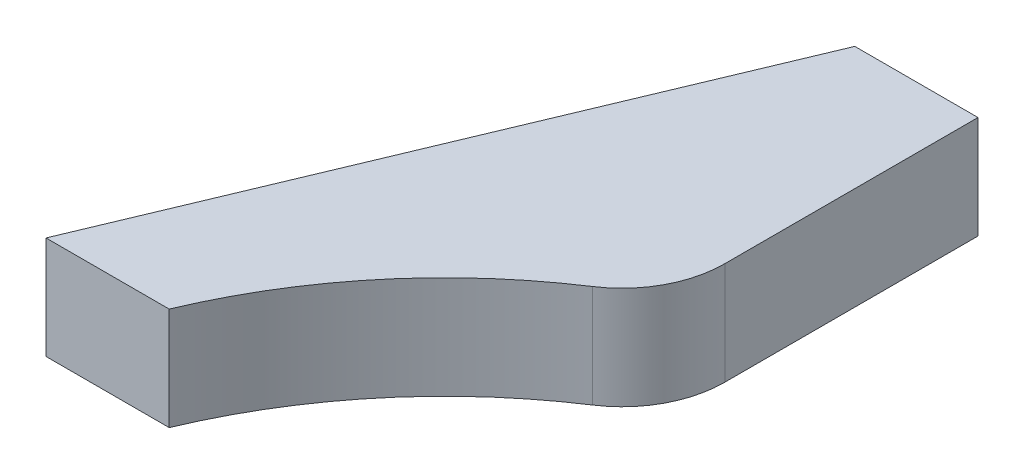
ISO-10303-21;
HEADER;
FILE_DESCRIPTION(('STEP AP214'),'2;1');
FILE_NAME('part.step','',(''),(''),'','','');
FILE_SCHEMA(('AUTOMOTIVE_DESIGN { 1 0 10303 214 1 1 1 1 }'));
ENDSEC;
DATA;
#1=APPLICATION_CONTEXT('core data for automotive mechanical design processes');
#2=APPLICATION_PROTOCOL_DEFINITION('international standard','automotive_design',2000,#1);
#3=PRODUCT_CONTEXT('',#1,'mechanical');
#4=PRODUCT('Part','Part','',(#3));
#5=PRODUCT_RELATED_PRODUCT_CATEGORY('part','',(#4));
#6=PRODUCT_DEFINITION_FORMATION('','',#4);
#7=PRODUCT_DEFINITION_CONTEXT('part definition',#1,'design');
#8=PRODUCT_DEFINITION('design','',#6,#7);
#9=PRODUCT_DEFINITION_SHAPE('','',#8);
#10=(LENGTH_UNIT() NAMED_UNIT(*) SI_UNIT(.MILLI.,.METRE.));
#11=(NAMED_UNIT(*) PLANE_ANGLE_UNIT() SI_UNIT($,.RADIAN.));
#12=(NAMED_UNIT(*) SI_UNIT($,.STERADIAN.) SOLID_ANGLE_UNIT());
#13=UNCERTAINTY_MEASURE_WITH_UNIT(LENGTH_MEASURE(1.E-05),#10,'distance_accuracy_value','');
#14=(GEOMETRIC_REPRESENTATION_CONTEXT(3) GLOBAL_UNCERTAINTY_ASSIGNED_CONTEXT((#13)) GLOBAL_UNIT_ASSIGNED_CONTEXT((#10,
#11,#12)) REPRESENTATION_CONTEXT('',''));
#15=CARTESIAN_POINT('',(0.,0.,0.));
#16=DIRECTION('',(0.,0.,1.));
#17=DIRECTION('',(1.,0.,0.));
#18=AXIS2_PLACEMENT_3D('',#15,#16,#17);
#19=CARTESIAN_POINT('',(0.,5.,0.));
#20=DIRECTION('',(0.,1.,0.));
#21=DIRECTION('',(0.,0.,1.));
#22=AXIS2_PLACEMENT_3D('',#19,#20,#21);
#23=PLANE('',#22);
#24=DIRECTION('',(1.,0.,0.));
#25=VECTOR('',#24,1.);
#26=CARTESIAN_POINT('',(0.,5.,18.5500745429482));
#27=LINE('',#26,#25);
#28=CARTESIAN_POINT('',(-3.,5.,18.5500745429482));
#29=VERTEX_POINT('',#28);
#30=CARTESIAN_POINT('',(3.,5.,18.5500745429482));
#31=VERTEX_POINT('',#30);
#32=EDGE_CURVE('E102',#29,#31,#27,.T.);
#33=ORIENTED_EDGE('',*,*,#32,.F.);
#34=DIRECTION('',(-0.38580699347817,0.,0.922579516238755));
#35=VECTOR('',#34,1.);
#36=CARTESIAN_POINT('',(-3.,5.,18.5500745429482));
#37=LINE('',#36,#35);
#38=CARTESIAN_POINT('',(-14.6149676840736,5.,46.3249242689621));
#39=VERTEX_POINT('',#38);
#40=EDGE_CURVE('E104',#29,#39,#37,.T.);
#41=ORIENTED_EDGE('',*,*,#40,.T.);
#42=DIRECTION('',(1.,0.,0.));
#43=VECTOR('',#42,1.);
#44=CARTESIAN_POINT('',(0.,5.,46.3249242689621));
#45=LINE('',#44,#43);
#46=CARTESIAN_POINT('',(-8.61496768407357,5.,46.3249242689621));
#47=VERTEX_POINT('',#46);
#48=EDGE_CURVE('E145',#39,#47,#45,.T.);
#49=ORIENTED_EDGE('',*,*,#48,.T.);
#50=CARTESIAN_POINT('',(14.4495202218953,5.,55.9700991059163));
#51=DIRECTION('',(0.,-1.,0.));
#52=DIRECTION('',(0.,0.,1.));
#53=AXIS2_PLACEMENT_3D('',#50,#51,#52);
#54=CIRCLE('',#53,25.);
#55=CARTESIAN_POINT('',(0.741586703649219,5.,35.0633404221953));
#56=VERTEX_POINT('',#55);
#57=EDGE_CURVE('E125',#47,#56,#54,.T.);
#58=ORIENTED_EDGE('',*,*,#57,.T.);
#59=CARTESIAN_POINT('',(-1.99999999999999,5.,30.8819886854511));
#60=DIRECTION('',(0.,1.,0.));
#61=DIRECTION('',(0.,0.,1.));
#62=AXIS2_PLACEMENT_3D('',#59,#60,#61);
#63=CIRCLE('',#62,5.);
#64=CARTESIAN_POINT('',(3.,5.,30.8819886854511));
#65=VERTEX_POINT('',#64);
#66=EDGE_CURVE('E65',#56,#65,#63,.T.);
#67=ORIENTED_EDGE('',*,*,#66,.T.);
#68=DIRECTION('',(0.,0.,-1.));
#69=VECTOR('',#68,1.);
#70=CARTESIAN_POINT('',(3.00000000000001,5.,43.8541019662497));
#71=LINE('',#70,#69);
#72=EDGE_CURVE('E118',#65,#31,#71,.T.);
#73=ORIENTED_EDGE('',*,*,#72,.T.);
#74=EDGE_LOOP('',(#33,#41,#49,#58,#67,#73));
#75=FACE_BOUND('',#74,.T.);
#76=ADVANCED_FACE('F42',(#75),#23,.T.);
#77=CARTESIAN_POINT('',(0.,0.,0.));
#78=DIRECTION('',(0.,1.,0.));
#79=DIRECTION('',(0.,0.,1.));
#80=AXIS2_PLACEMENT_3D('',#77,#78,#79);
#81=PLANE('',#80);
#82=DIRECTION('',(-0.38580699347817,0.,0.922579516238755));
#83=VECTOR('',#82,1.);
#84=CARTESIAN_POINT('',(-3.,0.,18.5500745429482));
#85=LINE('',#84,#83);
#86=CARTESIAN_POINT('',(-3.,0.,18.5500745429482));
#87=VERTEX_POINT('',#86);
#88=CARTESIAN_POINT('',(-14.6149676840736,0.,46.3249242689621));
#89=VERTEX_POINT('',#88);
#90=EDGE_CURVE('E113',#87,#89,#85,.T.);
#91=ORIENTED_EDGE('',*,*,#90,.F.);
#92=DIRECTION('',(1.,0.,0.));
#93=VECTOR('',#92,1.);
#94=CARTESIAN_POINT('',(0.,0.,18.5500745429482));
#95=LINE('',#94,#93);
#96=CARTESIAN_POINT('',(3.,0.,18.5500745429482));
#97=VERTEX_POINT('',#96);
#98=EDGE_CURVE('E99',#87,#97,#95,.T.);
#99=ORIENTED_EDGE('',*,*,#98,.T.);
#100=DIRECTION('',(0.,0.,-1.));
#101=VECTOR('',#100,1.);
#102=CARTESIAN_POINT('',(3.,0.,3.35410196624968));
#103=LINE('',#102,#101);
#104=CARTESIAN_POINT('',(3.00000000000001,0.,30.8819886854511));
#105=VERTEX_POINT('',#104);
#106=EDGE_CURVE('E109',#105,#97,#103,.T.);
#107=ORIENTED_EDGE('',*,*,#106,.F.);
#108=CARTESIAN_POINT('',(-1.99999999999999,0.,30.8819886854511));
#109=DIRECTION('',(0.,1.,0.));
#110=DIRECTION('',(0.,0.,1.));
#111=AXIS2_PLACEMENT_3D('',#108,#109,#110);
#112=CIRCLE('',#111,5.);
#113=CARTESIAN_POINT('',(0.741586703649219,0.,35.0633404221953));
#114=VERTEX_POINT('',#113);
#115=EDGE_CURVE('E11',#105,#114,#112,.F.);
#116=ORIENTED_EDGE('',*,*,#115,.T.);
#117=CARTESIAN_POINT('',(14.4495202218953,0.,55.9700991059163));
#118=DIRECTION('',(0.,-1.,0.));
#119=DIRECTION('',(0.,0.,1.));
#120=AXIS2_PLACEMENT_3D('',#117,#118,#119);
#121=CIRCLE('',#120,25.);
#122=CARTESIAN_POINT('',(-8.61496768407357,0.,46.3249242689621));
#123=VERTEX_POINT('',#122);
#124=EDGE_CURVE('E119',#123,#114,#121,.T.);
#125=ORIENTED_EDGE('',*,*,#124,.F.);
#126=DIRECTION('',(1.,0.,0.));
#127=VECTOR('',#126,1.);
#128=CARTESIAN_POINT('',(0.,0.,46.3249242689621));
#129=LINE('',#128,#127);
#130=EDGE_CURVE('E141',#89,#123,#129,.T.);
#131=ORIENTED_EDGE('',*,*,#130,.F.);
#132=EDGE_LOOP('',(#91,#99,#107,#116,#125,#131));
#133=FACE_BOUND('',#132,.T.);
#134=ADVANCED_FACE('F108',(#133),#81,.F.);
#135=CARTESIAN_POINT('',(14.4495202218953,0.,55.9700991059163));
#136=DIRECTION('',(0.,1.,0.));
#137=DIRECTION('',(0.,0.,1.));
#138=AXIS2_PLACEMENT_3D('',#135,#136,#137);
#139=CYLINDRICAL_SURFACE('',#138,25.);
#140=ORIENTED_EDGE('',*,*,#57,.F.);
#141=DIRECTION('',(0.,1.,0.));
#142=VECTOR('',#141,1.);
#143=CARTESIAN_POINT('',(-8.61496768407357,0.,46.3249242689621));
#144=LINE('',#143,#142);
#145=EDGE_CURVE('E144',#123,#47,#144,.T.);
#146=ORIENTED_EDGE('',*,*,#145,.F.);
#147=ORIENTED_EDGE('',*,*,#124,.T.);
#148=DIRECTION('',(0.,1.,0.));
#149=VECTOR('',#148,1.);
#150=CARTESIAN_POINT('',(0.741586703649219,0.,35.0633404221953));
#151=LINE('',#150,#149);
#152=EDGE_CURVE('E123',#114,#56,#151,.T.);
#153=ORIENTED_EDGE('',*,*,#152,.T.);
#154=EDGE_LOOP('',(#140,#146,#147,#153));
#155=FACE_BOUND('',#154,.T.);
#156=ADVANCED_FACE('F137',(#155),#139,.F.);
#157=CARTESIAN_POINT('',(3.,5.,3.35410196624968));
#158=DIRECTION('',(-1.,0.,0.));
#159=DIRECTION('',(0.,0.,1.));
#160=AXIS2_PLACEMENT_3D('',#157,#158,#159);
#161=PLANE('',#160);
#162=ORIENTED_EDGE('',*,*,#106,.T.);
#163=DIRECTION('',(0.,1.,0.));
#164=VECTOR('',#163,1.);
#165=CARTESIAN_POINT('',(3.,0.,18.5500745429482));
#166=LINE('',#165,#164);
#167=EDGE_CURVE('E96',#97,#31,#166,.T.);
#168=ORIENTED_EDGE('',*,*,#167,.T.);
#169=ORIENTED_EDGE('',*,*,#72,.F.);
#170=DIRECTION('',(0.,-1.,0.));
#171=VECTOR('',#170,1.);
#172=CARTESIAN_POINT('',(3.00000000000001,0.,30.8819886854511));
#173=LINE('',#172,#171);
#174=EDGE_CURVE('E51',#65,#105,#173,.T.);
#175=ORIENTED_EDGE('',*,*,#174,.T.);
#176=EDGE_LOOP('',(#162,#168,#169,#175));
#177=FACE_BOUND('',#176,.T.);
#178=ADVANCED_FACE('F116',(#177),#161,.F.);
#179=CARTESIAN_POINT('',(-3.,0.,18.5500745429482));
#180=DIRECTION('',(-0.922579516238755,0.,-0.38580699347817));
#181=DIRECTION('',(-0.38580699347817,0.,0.922579516238755));
#182=AXIS2_PLACEMENT_3D('',#179,#180,#181);
#183=PLANE('',#182);
#184=ORIENTED_EDGE('',*,*,#40,.F.);
#185=DIRECTION('',(0.,1.,0.));
#186=VECTOR('',#185,1.);
#187=CARTESIAN_POINT('',(-3.,0.,18.5500745429482));
#188=LINE('',#187,#186);
#189=EDGE_CURVE('E152',#87,#29,#188,.T.);
#190=ORIENTED_EDGE('',*,*,#189,.F.);
#191=ORIENTED_EDGE('',*,*,#90,.T.);
#192=DIRECTION('',(0.,1.,0.));
#193=VECTOR('',#192,1.);
#194=CARTESIAN_POINT('',(-14.6149676840736,0.,46.3249242689621));
#195=LINE('',#194,#193);
#196=EDGE_CURVE('E151',#89,#39,#195,.T.);
#197=ORIENTED_EDGE('',*,*,#196,.T.);
#198=EDGE_LOOP('',(#184,#190,#191,#197));
#199=FACE_BOUND('',#198,.T.);
#200=ADVANCED_FACE('F150',(#199),#183,.T.);
#201=CARTESIAN_POINT('',(-1.99999999999999,0.,30.8819886854511));
#202=DIRECTION('',(0.,1.,0.));
#203=DIRECTION('',(0.,0.,1.));
#204=AXIS2_PLACEMENT_3D('',#201,#202,#203);
#205=CYLINDRICAL_SURFACE('',#204,5.);
#206=ORIENTED_EDGE('',*,*,#115,.F.);
#207=ORIENTED_EDGE('',*,*,#174,.F.);
#208=ORIENTED_EDGE('',*,*,#66,.F.);
#209=ORIENTED_EDGE('',*,*,#152,.F.);
#210=EDGE_LOOP('',(#206,#207,#208,#209));
#211=FACE_BOUND('',#210,.T.);
#212=ADVANCED_FACE('F44',(#211),#205,.T.);
#213=CARTESIAN_POINT('',(0.,0.,46.3249242689621));
#214=DIRECTION('',(0.,0.,1.));
#215=DIRECTION('',(1.,0.,0.));
#216=AXIS2_PLACEMENT_3D('',#213,#214,#215);
#217=PLANE('',#216);
#218=ORIENTED_EDGE('',*,*,#48,.F.);
#219=ORIENTED_EDGE('',*,*,#196,.F.);
#220=ORIENTED_EDGE('',*,*,#130,.T.);
#221=ORIENTED_EDGE('',*,*,#145,.T.);
#222=EDGE_LOOP('',(#218,#219,#220,#221));
#223=FACE_BOUND('',#222,.T.);
#224=ADVANCED_FACE('F170',(#223),#217,.T.);
#225=CARTESIAN_POINT('',(0.,0.,18.5500745429482));
#226=DIRECTION('',(0.,0.,1.));
#227=DIRECTION('',(1.,0.,0.));
#228=AXIS2_PLACEMENT_3D('',#225,#226,#227);
#229=PLANE('',#228);
#230=ORIENTED_EDGE('',*,*,#32,.T.);
#231=ORIENTED_EDGE('',*,*,#167,.F.);
#232=ORIENTED_EDGE('',*,*,#98,.F.);
#233=ORIENTED_EDGE('',*,*,#189,.T.);
#234=EDGE_LOOP('',(#230,#231,#232,#233));
#235=FACE_BOUND('',#234,.T.);
#236=ADVANCED_FACE('F98',(#235),#229,.F.);
#237=CLOSED_SHELL('',(#76,#134,#156,#178,#200,#212,#224,#236));
#238=MANIFOLD_SOLID_BREP('B2',#237);
#239=ADVANCED_BREP_SHAPE_REPRESENTATION('',(#18,#238),#14);
#240=SHAPE_DEFINITION_REPRESENTATION(#9,#239);
ENDSEC;
END-ISO-10303-21;
